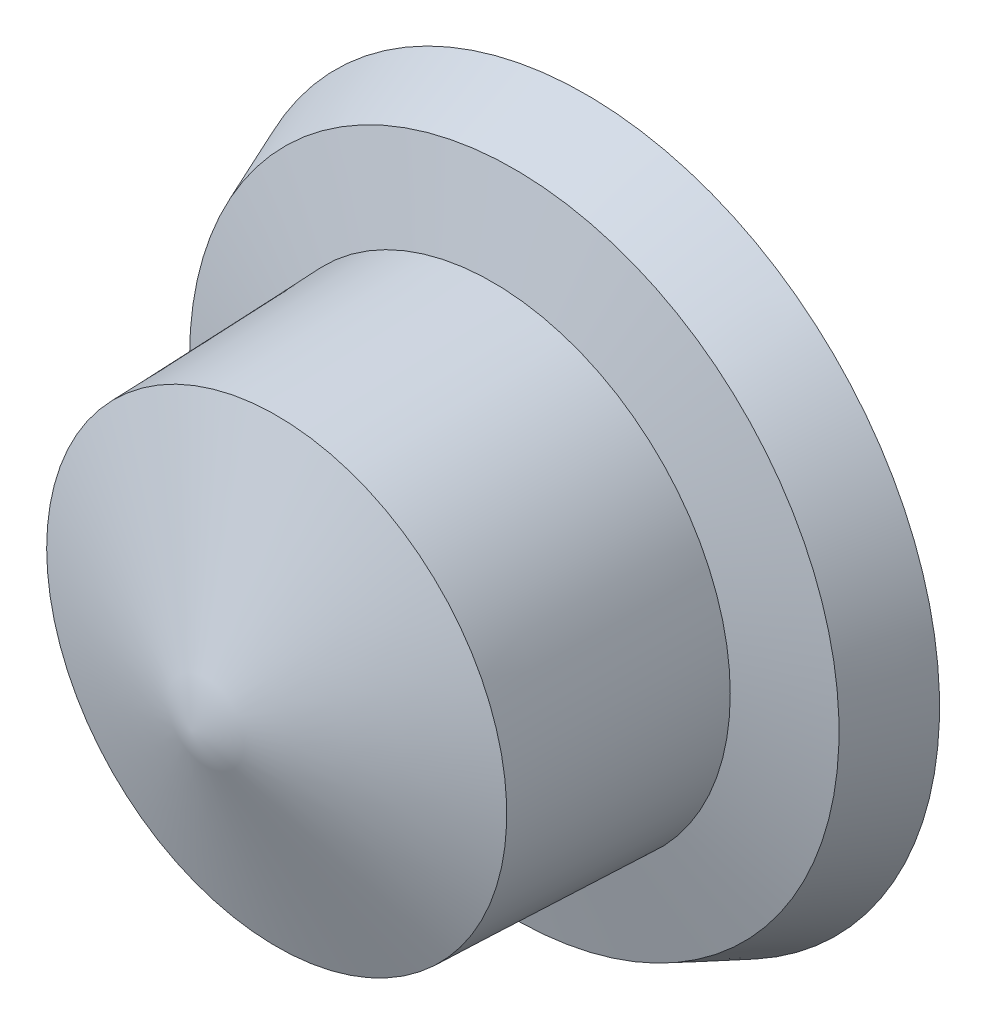
ISO-10303-21;
HEADER;
FILE_DESCRIPTION(('STEP AP214'),'2;1');
FILE_NAME('part.step','',(''),(''),'','','');
FILE_SCHEMA(('AUTOMOTIVE_DESIGN { 1 0 10303 214 1 1 1 1 }'));
ENDSEC;
DATA;
#1=APPLICATION_CONTEXT('core data for automotive mechanical design processes');
#2=APPLICATION_PROTOCOL_DEFINITION('international standard','automotive_design',2000,#1);
#3=PRODUCT_CONTEXT('',#1,'mechanical');
#4=PRODUCT('Part','Part','',(#3));
#5=PRODUCT_RELATED_PRODUCT_CATEGORY('part','',(#4));
#6=PRODUCT_DEFINITION_FORMATION('','',#4);
#7=PRODUCT_DEFINITION_CONTEXT('part definition',#1,'design');
#8=PRODUCT_DEFINITION('design','',#6,#7);
#9=PRODUCT_DEFINITION_SHAPE('','',#8);
#10=(LENGTH_UNIT() NAMED_UNIT(*) SI_UNIT(.MILLI.,.METRE.));
#11=(NAMED_UNIT(*) PLANE_ANGLE_UNIT() SI_UNIT($,.RADIAN.));
#12=(NAMED_UNIT(*) SI_UNIT($,.STERADIAN.) SOLID_ANGLE_UNIT());
#13=UNCERTAINTY_MEASURE_WITH_UNIT(LENGTH_MEASURE(1.E-05),#10,'distance_accuracy_value','');
#14=(GEOMETRIC_REPRESENTATION_CONTEXT(3) GLOBAL_UNCERTAINTY_ASSIGNED_CONTEXT((#13)) GLOBAL_UNIT_ASSIGNED_CONTEXT((#10,
#11,#12)) REPRESENTATION_CONTEXT('',''));
#15=CARTESIAN_POINT('',(0.,0.,0.));
#16=DIRECTION('',(0.,0.,1.));
#17=DIRECTION('',(1.,0.,0.));
#18=AXIS2_PLACEMENT_3D('',#15,#16,#17);
#19=CARTESIAN_POINT('',(0.,13.84173,-15.428214));
#20=DIRECTION('',(0.,0.,-1.));
#21=DIRECTION('',(-1.,0.,0.));
#22=AXIS2_PLACEMENT_3D('',#19,#20,#21);
#23=PLANE('',#22);
#24=CARTESIAN_POINT('',(0.,0.,-15.428214));
#25=DIRECTION('',(0.,0.,-1.));
#26=DIRECTION('',(-1.,0.,0.));
#27=AXIS2_PLACEMENT_3D('',#24,#25,#26);
#28=CIRCLE('',#27,13.84173);
#29=CARTESIAN_POINT('',(-13.84173,0.,-15.428214));
#30=VERTEX_POINT('',#29);
#31=EDGE_CURVE('E11',#30,#30,#28,.T.);
#32=ORIENTED_EDGE('',*,*,#31,.T.);
#33=EDGE_LOOP('',(#32));
#34=FACE_BOUND('',#33,.T.);
#35=ADVANCED_FACE('F35',(#34),#23,.T.);
#36=CARTESIAN_POINT('',(0.,0.,-15.428214));
#37=DIRECTION('',(0.,0.,-1.));
#38=DIRECTION('',(-1.,0.,0.));
#39=AXIS2_PLACEMENT_3D('',#36,#37,#38);
#40=CONICAL_SURFACE('',#39,13.84173,0.385208071641098);
#41=CARTESIAN_POINT('',(0.,0.,-12.629896));
#42=DIRECTION('',(0.,0.,-1.));
#43=DIRECTION('',(-1.,0.,0.));
#44=AXIS2_PLACEMENT_3D('',#41,#42,#43);
#45=CIRCLE('',#44,12.707112);
#46=CARTESIAN_POINT('',(-12.707112,0.,-12.629896));
#47=VERTEX_POINT('',#46);
#48=EDGE_CURVE('E41',#47,#47,#45,.T.);
#49=ORIENTED_EDGE('',*,*,#48,.T.);
#50=EDGE_LOOP('',(#49));
#51=FACE_BOUND('',#50,.T.);
#52=ORIENTED_EDGE('',*,*,#31,.F.);
#53=EDGE_LOOP('',(#52));
#54=FACE_BOUND('',#53,.T.);
#55=ADVANCED_FACE('F60',(#51,#54),#40,.T.);
#56=CARTESIAN_POINT('',(0.,0.,-12.629896));
#57=DIRECTION('',(0.,0.,-1.));
#58=DIRECTION('',(-1.,0.,0.));
#59=AXIS2_PLACEMENT_3D('',#56,#57,#58);
#60=CONICAL_SURFACE('',#59,12.707112,1.32571235801877);
#61=CARTESIAN_POINT('',(0.,0.,-11.778234));
#62=DIRECTION('',(0.,0.,-1.));
#63=DIRECTION('',(-1.,0.,0.));
#64=AXIS2_PLACEMENT_3D('',#61,#62,#63);
#65=CIRCLE('',#64,9.301988);
#66=CARTESIAN_POINT('',(-9.301988,0.,-11.778234));
#67=VERTEX_POINT('',#66);
#68=EDGE_CURVE('E53',#67,#67,#65,.T.);
#69=ORIENTED_EDGE('',*,*,#68,.T.);
#70=EDGE_LOOP('',(#69));
#71=FACE_BOUND('',#70,.T.);
#72=ORIENTED_EDGE('',*,*,#48,.F.);
#73=EDGE_LOOP('',(#72));
#74=FACE_BOUND('',#73,.T.);
#75=ADVANCED_FACE('F63',(#71,#74),#60,.T.);
#76=CARTESIAN_POINT('',(0.,0.,-11.778234));
#77=DIRECTION('',(0.,0.,-1.));
#78=DIRECTION('',(-1.,0.,0.));
#79=AXIS2_PLACEMENT_3D('',#76,#77,#78);
#80=CONICAL_SURFACE('',#79,9.301988,0.0355060055340778);
#81=CARTESIAN_POINT('',(0.,0.,-3.333242));
#82=DIRECTION('',(0.,0.,-1.));
#83=DIRECTION('',(-1.,0.,0.));
#84=AXIS2_PLACEMENT_3D('',#81,#82,#83);
#85=CIRCLE('',#84,9.002014);
#86=CARTESIAN_POINT('',(-9.002014,0.,-3.333242));
#87=VERTEX_POINT('',#86);
#88=EDGE_CURVE('E51',#87,#87,#85,.T.);
#89=ORIENTED_EDGE('',*,*,#88,.T.);
#90=EDGE_LOOP('',(#89));
#91=FACE_BOUND('',#90,.T.);
#92=ORIENTED_EDGE('',*,*,#68,.F.);
#93=EDGE_LOOP('',(#92));
#94=FACE_BOUND('',#93,.T.);
#95=ADVANCED_FACE('F47',(#91,#94),#80,.T.);
#96=CARTESIAN_POINT('',(0.,0.,-3.333242));
#97=DIRECTION('',(0.,0.,-1.));
#98=DIRECTION('',(-1.,0.,0.));
#99=AXIS2_PLACEMENT_3D('',#96,#97,#98);
#100=CONICAL_SURFACE('',#99,9.002014,1.21617246595529);
#101=CARTESIAN_POINT('',(0.,0.,0.));
#102=VERTEX_POINT('',#101);
#103=VERTEX_LOOP('',#102);
#104=FACE_BOUND('',#103,.T.);
#105=ORIENTED_EDGE('',*,*,#88,.F.);
#106=EDGE_LOOP('',(#105));
#107=FACE_BOUND('',#106,.T.);
#108=ADVANCED_FACE('F44',(#104,#107),#100,.T.);
#109=CLOSED_SHELL('',(#35,#55,#75,#95,#108));
#110=MANIFOLD_SOLID_BREP('B2',#109);
#111=ADVANCED_BREP_SHAPE_REPRESENTATION('',(#18,#110),#14);
#112=SHAPE_DEFINITION_REPRESENTATION(#9,#111);
ENDSEC;
END-ISO-10303-21;
